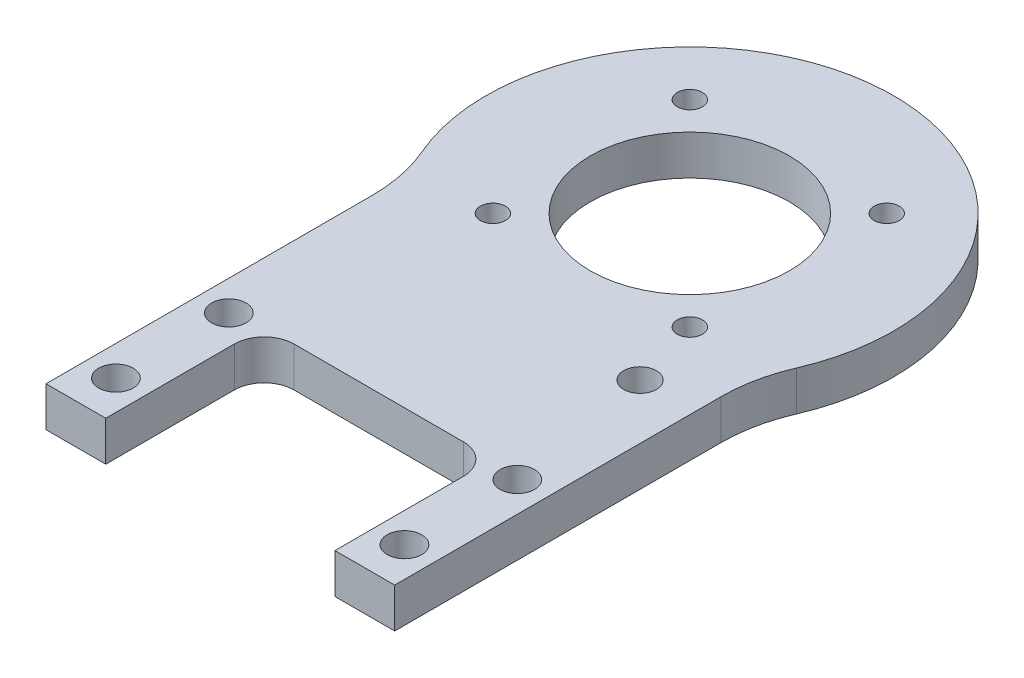
ISO-10303-21;
HEADER;
FILE_DESCRIPTION(('STEP AP214'),'2;1');
FILE_NAME('part.step','',(''),(''),'','','');
FILE_SCHEMA(('AUTOMOTIVE_DESIGN { 1 0 10303 214 1 1 1 1 }'));
ENDSEC;
DATA;
#1=APPLICATION_CONTEXT('core data for automotive mechanical design processes');
#2=APPLICATION_PROTOCOL_DEFINITION('international standard','automotive_design',2000,#1);
#3=PRODUCT_CONTEXT('',#1,'mechanical');
#4=PRODUCT('Part','Part','',(#3));
#5=PRODUCT_RELATED_PRODUCT_CATEGORY('part','',(#4));
#6=PRODUCT_DEFINITION_FORMATION('','',#4);
#7=PRODUCT_DEFINITION_CONTEXT('part definition',#1,'design');
#8=PRODUCT_DEFINITION('design','',#6,#7);
#9=PRODUCT_DEFINITION_SHAPE('','',#8);
#10=(LENGTH_UNIT() NAMED_UNIT(*) SI_UNIT(.MILLI.,.METRE.));
#11=(NAMED_UNIT(*) PLANE_ANGLE_UNIT() SI_UNIT($,.RADIAN.));
#12=(NAMED_UNIT(*) SI_UNIT($,.STERADIAN.) SOLID_ANGLE_UNIT());
#13=UNCERTAINTY_MEASURE_WITH_UNIT(LENGTH_MEASURE(1.E-05),#10,'distance_accuracy_value','');
#14=(GEOMETRIC_REPRESENTATION_CONTEXT(3) GLOBAL_UNCERTAINTY_ASSIGNED_CONTEXT((#13)) GLOBAL_UNIT_ASSIGNED_CONTEXT((#10,
#11,#12)) REPRESENTATION_CONTEXT('',''));
#15=CARTESIAN_POINT('',(0.,0.,0.));
#16=DIRECTION('',(0.,0.,1.));
#17=DIRECTION('',(1.,0.,0.));
#18=AXIS2_PLACEMENT_3D('',#15,#16,#17);
#19=CARTESIAN_POINT('',(0.,601.119027045273,-3.206573008689));
#20=DIRECTION('',(0.,-1.,0.));
#21=DIRECTION('',(0.,0.,-1.));
#22=AXIS2_PLACEMENT_3D('',#19,#20,#21);
#23=CYLINDRICAL_SURFACE('',#22,32.4999985);
#24=CARTESIAN_POINT('',(0.,594.769027045273,-3.20657300868901));
#25=DIRECTION('',(0.,1.,0.));
#26=DIRECTION('',(0.,0.,1.));
#27=AXIS2_PLACEMENT_3D('',#24,#25,#26);
#28=CIRCLE('',#27,32.4999985);
#29=CARTESIAN_POINT('',(-29.859023576828,594.769027045273,9.6265331444771));
#30=VERTEX_POINT('',#29);
#31=CARTESIAN_POINT('',(29.8590235768281,594.769027045273,9.62653314447709));
#32=VERTEX_POINT('',#31);
#33=EDGE_CURVE('E183',#30,#32,#28,.F.);
#34=ORIENTED_EDGE('',*,*,#33,.F.);
#35=DIRECTION('',(0.,-1.,0.));
#36=VECTOR('',#35,1.);
#37=CARTESIAN_POINT('',(-29.859023576828,601.119027045273,9.6265331444771));
#38=LINE('',#37,#36);
#39=CARTESIAN_POINT('',(-29.859023576828,601.119027045273,9.6265331444771));
#40=VERTEX_POINT('',#39);
#41=EDGE_CURVE('E11',#40,#30,#38,.T.);
#42=ORIENTED_EDGE('',*,*,#41,.F.);
#43=CARTESIAN_POINT('',(0.,601.119027045273,-3.206573008689));
#44=DIRECTION('',(0.,1.,0.));
#45=DIRECTION('',(0.,0.,1.));
#46=AXIS2_PLACEMENT_3D('',#43,#44,#45);
#47=CIRCLE('',#46,32.4999985);
#48=CARTESIAN_POINT('',(29.8590235768281,601.119027045273,9.62653314447709));
#49=VERTEX_POINT('',#48);
#50=EDGE_CURVE('E365',#40,#49,#47,.F.);
#51=ORIENTED_EDGE('',*,*,#50,.T.);
#52=DIRECTION('',(0.,-1.,0.));
#53=VECTOR('',#52,1.);
#54=CARTESIAN_POINT('',(29.8590235768281,601.119027045273,9.62653314447709));
#55=LINE('',#54,#53);
#56=EDGE_CURVE('E52',#49,#32,#55,.T.);
#57=ORIENTED_EDGE('',*,*,#56,.T.);
#58=EDGE_LOOP('',(#34,#42,#51,#57));
#59=FACE_BOUND('',#58,.T.);
#60=ADVANCED_FACE('F35',(#59),#23,.T.);
#61=CARTESIAN_POINT('',(-53.1950000031479,601.119027045273,19.6560996470854));
#62=DIRECTION('',(0.,-1.,0.));
#63=DIRECTION('',(0.,0.,-1.));
#64=AXIS2_PLACEMENT_3D('',#61,#62,#63);
#65=CYLINDRICAL_SURFACE('',#64,25.4);
#66=CARTESIAN_POINT('',(-53.1950000031479,594.769027045273,19.6560996470854));
#67=DIRECTION('',(0.,1.,0.));
#68=DIRECTION('',(0.,0.,1.));
#69=AXIS2_PLACEMENT_3D('',#66,#67,#68);
#70=CIRCLE('',#69,25.4);
#71=CARTESIAN_POINT('',(-27.7950000031479,594.769027045273,19.6560996470854));
#72=VERTEX_POINT('',#71);
#73=EDGE_CURVE('E180',#30,#72,#70,.F.);
#74=ORIENTED_EDGE('',*,*,#73,.T.);
#75=DIRECTION('',(0.,-1.,0.));
#76=VECTOR('',#75,1.);
#77=CARTESIAN_POINT('',(-27.7950000031479,601.119027045273,19.6560996470854));
#78=LINE('',#77,#76);
#79=CARTESIAN_POINT('',(-27.7950000031479,601.119027045273,19.6560996470854));
#80=VERTEX_POINT('',#79);
#81=EDGE_CURVE('E44',#80,#72,#78,.T.);
#82=ORIENTED_EDGE('',*,*,#81,.F.);
#83=CARTESIAN_POINT('',(-53.1950000031479,601.119027045273,19.6560996470854));
#84=DIRECTION('',(0.,1.,0.));
#85=DIRECTION('',(0.,0.,1.));
#86=AXIS2_PLACEMENT_3D('',#83,#84,#85);
#87=CIRCLE('',#86,25.4);
#88=EDGE_CURVE('E363',#40,#80,#87,.F.);
#89=ORIENTED_EDGE('',*,*,#88,.F.);
#90=ORIENTED_EDGE('',*,*,#41,.T.);
#91=EDGE_LOOP('',(#74,#82,#89,#90));
#92=FACE_BOUND('',#91,.T.);
#93=ADVANCED_FACE('F181',(#92),#65,.F.);
#94=CARTESIAN_POINT('',(-27.7950000031479,601.119027045273,0.));
#95=DIRECTION('',(-1.,0.,0.));
#96=DIRECTION('',(0.,-1.,0.));
#97=AXIS2_PLACEMENT_3D('',#94,#95,#96);
#98=PLANE('',#97);
#99=DIRECTION('',(0.,0.,-1.));
#100=VECTOR('',#99,1.);
#101=CARTESIAN_POINT('',(-27.7950000031479,594.769027045273,0.));
#102=LINE('',#101,#100);
#103=CARTESIAN_POINT('',(-27.7950000031479,594.769027045273,71.6409269913124));
#104=VERTEX_POINT('',#103);
#105=EDGE_CURVE('E174',#104,#72,#102,.T.);
#106=ORIENTED_EDGE('',*,*,#105,.F.);
#107=DIRECTION('',(0.,-1.,0.));
#108=VECTOR('',#107,1.);
#109=CARTESIAN_POINT('',(-27.7950000031479,601.119027045273,71.6409269913124));
#110=LINE('',#109,#108);
#111=CARTESIAN_POINT('',(-27.7950000031479,601.119027045273,71.6409269913124));
#112=VERTEX_POINT('',#111);
#113=EDGE_CURVE('E166',#112,#104,#110,.T.);
#114=ORIENTED_EDGE('',*,*,#113,.F.);
#115=DIRECTION('',(0.,0.,-1.));
#116=VECTOR('',#115,1.);
#117=CARTESIAN_POINT('',(-27.7950000031479,601.119027045273,0.));
#118=LINE('',#117,#116);
#119=EDGE_CURVE('E177',#112,#80,#118,.T.);
#120=ORIENTED_EDGE('',*,*,#119,.T.);
#121=ORIENTED_EDGE('',*,*,#81,.T.);
#122=EDGE_LOOP('',(#106,#114,#120,#121));
#123=FACE_BOUND('',#122,.T.);
#124=ADVANCED_FACE('F172',(#123),#98,.T.);
#125=CARTESIAN_POINT('',(0.,601.119027045273,71.6409269913124));
#126=DIRECTION('',(0.,0.,1.));
#127=DIRECTION('',(0.,-1.,0.));
#128=AXIS2_PLACEMENT_3D('',#125,#126,#127);
#129=PLANE('',#128);
#130=DIRECTION('',(-1.,0.,0.));
#131=VECTOR('',#130,1.);
#132=CARTESIAN_POINT('',(0.,594.769027045273,71.6409269913124));
#133=LINE('',#132,#131);
#134=CARTESIAN_POINT('',(-18.2700000031479,594.769027045273,71.6409269913124));
#135=VERTEX_POINT('',#134);
#136=EDGE_CURVE('E189',#135,#104,#133,.T.);
#137=ORIENTED_EDGE('',*,*,#136,.F.);
#138=DIRECTION('',(0.,-1.,0.));
#139=VECTOR('',#138,1.);
#140=CARTESIAN_POINT('',(-18.2700000031479,601.119027045273,71.6409269913124));
#141=LINE('',#140,#139);
#142=CARTESIAN_POINT('',(-18.2700000031479,601.119027045273,71.6409269913124));
#143=VERTEX_POINT('',#142);
#144=EDGE_CURVE('E164',#143,#135,#141,.T.);
#145=ORIENTED_EDGE('',*,*,#144,.F.);
#146=DIRECTION('',(-1.,0.,0.));
#147=VECTOR('',#146,1.);
#148=CARTESIAN_POINT('',(0.,601.119027045273,71.6409269913124));
#149=LINE('',#148,#147);
#150=EDGE_CURVE('E359',#143,#112,#149,.T.);
#151=ORIENTED_EDGE('',*,*,#150,.T.);
#152=ORIENTED_EDGE('',*,*,#113,.T.);
#153=EDGE_LOOP('',(#137,#145,#151,#152));
#154=FACE_BOUND('',#153,.T.);
#155=ADVANCED_FACE('F399',(#154),#129,.T.);
#156=CARTESIAN_POINT('',(-18.2700000031479,601.119027045273,0.));
#157=DIRECTION('',(1.,0.,0.));
#158=DIRECTION('',(0.,0.,-1.));
#159=AXIS2_PLACEMENT_3D('',#156,#157,#158);
#160=PLANE('',#159);
#161=DIRECTION('',(0.,0.,1.));
#162=VECTOR('',#161,1.);
#163=CARTESIAN_POINT('',(-18.2700000031479,594.769027045273,0.));
#164=LINE('',#163,#162);
#165=CARTESIAN_POINT('',(-18.2700000031479,594.769027045273,51.1484269916459));
#166=VERTEX_POINT('',#165);
#167=EDGE_CURVE('E191',#166,#135,#164,.T.);
#168=ORIENTED_EDGE('',*,*,#167,.F.);
#169=DIRECTION('',(0.,-1.,0.));
#170=VECTOR('',#169,1.);
#171=CARTESIAN_POINT('',(-18.2700000031479,601.119027045273,51.1484269916459));
#172=LINE('',#171,#170);
#173=CARTESIAN_POINT('',(-18.2700000031479,601.119027045273,51.1484269916459));
#174=VERTEX_POINT('',#173);
#175=EDGE_CURVE('E162',#174,#166,#172,.T.);
#176=ORIENTED_EDGE('',*,*,#175,.F.);
#177=DIRECTION('',(0.,0.,1.));
#178=VECTOR('',#177,1.);
#179=CARTESIAN_POINT('',(-18.2700000031479,601.119027045273,0.));
#180=LINE('',#179,#178);
#181=EDGE_CURVE('E356',#174,#143,#180,.T.);
#182=ORIENTED_EDGE('',*,*,#181,.T.);
#183=ORIENTED_EDGE('',*,*,#144,.T.);
#184=EDGE_LOOP('',(#168,#176,#182,#183));
#185=FACE_BOUND('',#184,.T.);
#186=ADVANCED_FACE('F402',(#185),#160,.T.);
#187=CARTESIAN_POINT('',(-13.5075000031479,601.119027045273,51.1484269916459));
#188=DIRECTION('',(0.,-1.,0.));
#189=DIRECTION('',(0.,0.,-1.));
#190=AXIS2_PLACEMENT_3D('',#187,#188,#189);
#191=CYLINDRICAL_SURFACE('',#190,4.76250000000001);
#192=CARTESIAN_POINT('',(-13.5075000031479,594.769027045273,51.1484269916459));
#193=DIRECTION('',(0.,1.,0.));
#194=DIRECTION('',(0.,0.,1.));
#195=AXIS2_PLACEMENT_3D('',#192,#193,#194);
#196=CIRCLE('',#195,4.76250000000001);
#197=CARTESIAN_POINT('',(-13.5075000032041,594.769027045273,46.3859269916459));
#198=VERTEX_POINT('',#197);
#199=EDGE_CURVE('E196',#166,#198,#196,.F.);
#200=ORIENTED_EDGE('',*,*,#199,.T.);
#201=DIRECTION('',(0.,-1.,0.));
#202=VECTOR('',#201,1.);
#203=CARTESIAN_POINT('',(-13.5075000032041,601.119027045273,46.3859269916459));
#204=LINE('',#203,#202);
#205=CARTESIAN_POINT('',(-13.5075000032041,601.119027045273,46.3859269916459));
#206=VERTEX_POINT('',#205);
#207=EDGE_CURVE('E160',#206,#198,#204,.T.);
#208=ORIENTED_EDGE('',*,*,#207,.F.);
#209=CARTESIAN_POINT('',(-13.5075000031479,601.119027045273,51.1484269916459));
#210=DIRECTION('',(0.,1.,0.));
#211=DIRECTION('',(0.,0.,1.));
#212=AXIS2_PLACEMENT_3D('',#209,#210,#211);
#213=CIRCLE('',#212,4.76250000000001);
#214=EDGE_CURVE('E354',#174,#206,#213,.F.);
#215=ORIENTED_EDGE('',*,*,#214,.F.);
#216=ORIENTED_EDGE('',*,*,#175,.T.);
#217=EDGE_LOOP('',(#200,#208,#215,#216));
#218=FACE_BOUND('',#217,.T.);
#219=ADVANCED_FACE('F407',(#218),#191,.F.);
#220=CARTESIAN_POINT('',(5.47609017684926E-10,601.119027045273,46.3859269914864));
#221=DIRECTION('',(1.1805494782E-11,0.,1.));
#222=DIRECTION('',(1.,0.,-1.1805494782E-11));
#223=AXIS2_PLACEMENT_3D('',#220,#221,#222);
#224=PLANE('',#223);
#225=DIRECTION('',(-1.,0.,1.1805494782E-11));
#226=VECTOR('',#225,1.);
#227=CARTESIAN_POINT('',(5.47608819056227E-10,594.769027045273,46.3859269914864));
#228=LINE('',#227,#226);
#229=CARTESIAN_POINT('',(13.5075000032042,594.769027045273,46.3859269916459));
#230=VERTEX_POINT('',#229);
#231=EDGE_CURVE('E199',#230,#198,#228,.T.);
#232=ORIENTED_EDGE('',*,*,#231,.F.);
#233=DIRECTION('',(0.,-1.,0.));
#234=VECTOR('',#233,1.);
#235=CARTESIAN_POINT('',(13.5075000032042,601.119027045273,46.3859269916459));
#236=LINE('',#235,#234);
#237=CARTESIAN_POINT('',(13.5075000032042,601.119027045273,46.3859269916459));
#238=VERTEX_POINT('',#237);
#239=EDGE_CURVE('E158',#238,#230,#236,.T.);
#240=ORIENTED_EDGE('',*,*,#239,.F.);
#241=DIRECTION('',(-1.,0.,1.1805494782E-11));
#242=VECTOR('',#241,1.);
#243=CARTESIAN_POINT('',(5.47609017684926E-10,601.119027045273,46.3859269914864));
#244=LINE('',#243,#242);
#245=EDGE_CURVE('E351',#238,#206,#244,.T.);
#246=ORIENTED_EDGE('',*,*,#245,.T.);
#247=ORIENTED_EDGE('',*,*,#207,.T.);
#248=EDGE_LOOP('',(#232,#240,#246,#247));
#249=FACE_BOUND('',#248,.T.);
#250=ADVANCED_FACE('F411',(#249),#224,.T.);
#251=CARTESIAN_POINT('',(13.5075000031479,601.119027045273,51.1484269916459));
#252=DIRECTION('',(0.,-1.,0.));
#253=DIRECTION('',(0.,0.,-1.));
#254=AXIS2_PLACEMENT_3D('',#251,#252,#253);
#255=CYLINDRICAL_SURFACE('',#254,4.76250000000001);
#256=CARTESIAN_POINT('',(13.5075000031479,594.769027045273,51.1484269916459));
#257=DIRECTION('',(0.,1.,0.));
#258=DIRECTION('',(0.,0.,1.));
#259=AXIS2_PLACEMENT_3D('',#256,#257,#258);
#260=CIRCLE('',#259,4.76250000000001);
#261=CARTESIAN_POINT('',(18.2700000031479,594.769027045273,51.1484269916459));
#262=VERTEX_POINT('',#261);
#263=EDGE_CURVE('E202',#262,#230,#260,.T.);
#264=ORIENTED_EDGE('',*,*,#263,.F.);
#265=DIRECTION('',(0.,-1.,0.));
#266=VECTOR('',#265,1.);
#267=CARTESIAN_POINT('',(18.2700000031479,601.119027045273,51.1484269916459));
#268=LINE('',#267,#266);
#269=CARTESIAN_POINT('',(18.2700000031479,601.119027045273,51.1484269916459));
#270=VERTEX_POINT('',#269);
#271=EDGE_CURVE('E152',#270,#262,#268,.T.);
#272=ORIENTED_EDGE('',*,*,#271,.F.);
#273=CARTESIAN_POINT('',(13.5075000031479,601.119027045273,51.1484269916459));
#274=DIRECTION('',(0.,1.,0.));
#275=DIRECTION('',(0.,0.,1.));
#276=AXIS2_PLACEMENT_3D('',#273,#274,#275);
#277=CIRCLE('',#276,4.76250000000001);
#278=EDGE_CURVE('E348',#270,#238,#277,.T.);
#279=ORIENTED_EDGE('',*,*,#278,.T.);
#280=ORIENTED_EDGE('',*,*,#239,.T.);
#281=EDGE_LOOP('',(#264,#272,#279,#280));
#282=FACE_BOUND('',#281,.T.);
#283=ADVANCED_FACE('F414',(#282),#255,.F.);
#284=CARTESIAN_POINT('',(18.270000003148,601.119027045273,0.));
#285=DIRECTION('',(1.,0.,0.));
#286=DIRECTION('',(0.,0.,-1.));
#287=AXIS2_PLACEMENT_3D('',#284,#285,#286);
#288=PLANE('',#287);
#289=DIRECTION('',(0.,0.,1.));
#290=VECTOR('',#289,1.);
#291=CARTESIAN_POINT('',(18.270000003148,594.769027045273,0.));
#292=LINE('',#291,#290);
#293=CARTESIAN_POINT('',(18.2700000031479,594.769027045273,71.6409269913124));
#294=VERTEX_POINT('',#293);
#295=EDGE_CURVE('E205',#262,#294,#292,.T.);
#296=ORIENTED_EDGE('',*,*,#295,.T.);
#297=DIRECTION('',(0.,-1.,0.));
#298=VECTOR('',#297,1.);
#299=CARTESIAN_POINT('',(18.2700000031479,601.119027045273,71.6409269913124));
#300=LINE('',#299,#298);
#301=CARTESIAN_POINT('',(18.2700000031479,601.119027045273,71.6409269913124));
#302=VERTEX_POINT('',#301);
#303=EDGE_CURVE('E150',#302,#294,#300,.T.);
#304=ORIENTED_EDGE('',*,*,#303,.F.);
#305=DIRECTION('',(0.,0.,1.));
#306=VECTOR('',#305,1.);
#307=CARTESIAN_POINT('',(18.270000003148,601.119027045273,0.));
#308=LINE('',#307,#306);
#309=EDGE_CURVE('E143',#270,#302,#308,.T.);
#310=ORIENTED_EDGE('',*,*,#309,.F.);
#311=ORIENTED_EDGE('',*,*,#271,.T.);
#312=EDGE_LOOP('',(#296,#304,#310,#311));
#313=FACE_BOUND('',#312,.T.);
#314=ADVANCED_FACE('F417',(#313),#288,.F.);
#315=CARTESIAN_POINT('',(0.,601.119027045273,71.6409269913124));
#316=DIRECTION('',(0.,0.,-1.));
#317=DIRECTION('',(0.,1.,0.));
#318=AXIS2_PLACEMENT_3D('',#315,#316,#317);
#319=PLANE('',#318);
#320=DIRECTION('',(1.,0.,0.));
#321=VECTOR('',#320,1.);
#322=CARTESIAN_POINT('',(0.,594.769027045273,71.6409269913124));
#323=LINE('',#322,#321);
#324=CARTESIAN_POINT('',(27.7950000031479,594.769027045273,71.6409269913124));
#325=VERTEX_POINT('',#324);
#326=EDGE_CURVE('E149',#294,#325,#323,.T.);
#327=ORIENTED_EDGE('',*,*,#326,.T.);
#328=DIRECTION('',(0.,-1.,0.));
#329=VECTOR('',#328,1.);
#330=CARTESIAN_POINT('',(27.7950000031479,601.119027045273,71.6409269913124));
#331=LINE('',#330,#329);
#332=CARTESIAN_POINT('',(27.7950000031479,601.119027045273,71.6409269913124));
#333=VERTEX_POINT('',#332);
#334=EDGE_CURVE('E130',#333,#325,#331,.T.);
#335=ORIENTED_EDGE('',*,*,#334,.F.);
#336=DIRECTION('',(1.,0.,0.));
#337=VECTOR('',#336,1.);
#338=CARTESIAN_POINT('',(0.,601.119027045273,71.6409269913124));
#339=LINE('',#338,#337);
#340=EDGE_CURVE('E135',#302,#333,#339,.T.);
#341=ORIENTED_EDGE('',*,*,#340,.F.);
#342=ORIENTED_EDGE('',*,*,#303,.T.);
#343=EDGE_LOOP('',(#327,#335,#341,#342));
#344=FACE_BOUND('',#343,.T.);
#345=ADVANCED_FACE('F148',(#344),#319,.F.);
#346=CARTESIAN_POINT('',(27.7950000031479,601.119027045273,0.));
#347=DIRECTION('',(-1.,0.,0.));
#348=DIRECTION('',(0.,-1.,0.));
#349=AXIS2_PLACEMENT_3D('',#346,#347,#348);
#350=PLANE('',#349);
#351=DIRECTION('',(0.,0.,-1.));
#352=VECTOR('',#351,1.);
#353=CARTESIAN_POINT('',(27.7950000031479,594.769027045273,0.));
#354=LINE('',#353,#352);
#355=CARTESIAN_POINT('',(27.7950000031479,594.769027045273,19.6560996470854));
#356=VERTEX_POINT('',#355);
#357=EDGE_CURVE('E209',#325,#356,#354,.T.);
#358=ORIENTED_EDGE('',*,*,#357,.T.);
#359=DIRECTION('',(0.,-1.,0.));
#360=VECTOR('',#359,1.);
#361=CARTESIAN_POINT('',(27.7950000031479,601.119027045273,19.6560996470854));
#362=LINE('',#361,#360);
#363=CARTESIAN_POINT('',(27.7950000031479,601.119027045273,19.6560996470854));
#364=VERTEX_POINT('',#363);
#365=EDGE_CURVE('E90',#364,#356,#362,.T.);
#366=ORIENTED_EDGE('',*,*,#365,.F.);
#367=DIRECTION('',(0.,0.,-1.));
#368=VECTOR('',#367,1.);
#369=CARTESIAN_POINT('',(27.7950000031479,601.119027045273,0.));
#370=LINE('',#369,#368);
#371=EDGE_CURVE('E126',#333,#364,#370,.T.);
#372=ORIENTED_EDGE('',*,*,#371,.F.);
#373=ORIENTED_EDGE('',*,*,#334,.T.);
#374=EDGE_LOOP('',(#358,#366,#372,#373));
#375=FACE_BOUND('',#374,.T.);
#376=ADVANCED_FACE('F128',(#375),#350,.F.);
#377=CARTESIAN_POINT('',(-23.,601.119027045273,47.2909269913124));
#378=DIRECTION('',(0.,-1.,0.));
#379=DIRECTION('',(0.,0.,-1.));
#380=AXIS2_PLACEMENT_3D('',#377,#378,#379);
#381=CYLINDRICAL_SURFACE('',#380,2.75000000007406);
#382=CARTESIAN_POINT('',(-23.,601.119027045273,47.2909269913124));
#383=DIRECTION('',(0.,1.,0.));
#384=DIRECTION('',(0.,0.,1.));
#385=AXIS2_PLACEMENT_3D('',#382,#383,#384);
#386=CIRCLE('',#385,2.75000000007406);
#387=CARTESIAN_POINT('',(-23.,601.119027045273,50.0409269913865));
#388=VERTEX_POINT('',#387);
#389=EDGE_CURVE('E228',#388,#388,#386,.T.);
#390=ORIENTED_EDGE('',*,*,#389,.T.);
#391=EDGE_LOOP('',(#390));
#392=FACE_BOUND('',#391,.T.);
#393=CARTESIAN_POINT('',(-23.,594.769027045273,47.2909269913124));
#394=DIRECTION('',(0.,1.,0.));
#395=DIRECTION('',(0.,0.,1.));
#396=AXIS2_PLACEMENT_3D('',#393,#394,#395);
#397=CIRCLE('',#396,2.75000000007406);
#398=CARTESIAN_POINT('',(-23.,594.769027045273,50.0409269913865));
#399=VERTEX_POINT('',#398);
#400=EDGE_CURVE('E220',#399,#399,#397,.T.);
#401=ORIENTED_EDGE('',*,*,#400,.F.);
#402=EDGE_LOOP('',(#401));
#403=FACE_BOUND('',#402,.T.);
#404=ADVANCED_FACE('F322',(#392,#403),#381,.F.);
#405=CARTESIAN_POINT('',(-23.,601.119027045273,65.2909269913124));
#406=DIRECTION('',(0.,-1.,0.));
#407=DIRECTION('',(0.,0.,-1.));
#408=AXIS2_PLACEMENT_3D('',#405,#406,#407);
#409=CYLINDRICAL_SURFACE('',#408,2.75000000007406);
#410=CARTESIAN_POINT('',(-23.,601.119027045273,65.2909269913124));
#411=DIRECTION('',(0.,1.,0.));
#412=DIRECTION('',(0.,0.,1.));
#413=AXIS2_PLACEMENT_3D('',#410,#411,#412);
#414=CIRCLE('',#413,2.75000000007406);
#415=CARTESIAN_POINT('',(-23.,601.119027045273,68.0409269913865));
#416=VERTEX_POINT('',#415);
#417=EDGE_CURVE('E233',#416,#416,#414,.T.);
#418=ORIENTED_EDGE('',*,*,#417,.T.);
#419=EDGE_LOOP('',(#418));
#420=FACE_BOUND('',#419,.T.);
#421=CARTESIAN_POINT('',(-23.,594.769027045273,65.2909269913124));
#422=DIRECTION('',(0.,1.,0.));
#423=DIRECTION('',(0.,0.,1.));
#424=AXIS2_PLACEMENT_3D('',#421,#422,#423);
#425=CIRCLE('',#424,2.75000000007406);
#426=CARTESIAN_POINT('',(-23.,594.769027045273,68.0409269913865));
#427=VERTEX_POINT('',#426);
#428=EDGE_CURVE('E217',#427,#427,#425,.T.);
#429=ORIENTED_EDGE('',*,*,#428,.F.);
#430=EDGE_LOOP('',(#429));
#431=FACE_BOUND('',#430,.T.);
#432=ADVANCED_FACE('F264',(#420,#431),#409,.F.);
#433=CARTESIAN_POINT('',(23.,601.119027045273,47.2909269913124));
#434=DIRECTION('',(0.,-1.,0.));
#435=DIRECTION('',(0.,0.,-1.));
#436=AXIS2_PLACEMENT_3D('',#433,#434,#435);
#437=CYLINDRICAL_SURFACE('',#436,2.75000000007407);
#438=CARTESIAN_POINT('',(23.,601.119027045273,47.2909269913124));
#439=DIRECTION('',(0.,1.,0.));
#440=DIRECTION('',(0.,0.,1.));
#441=AXIS2_PLACEMENT_3D('',#438,#439,#440);
#442=CIRCLE('',#441,2.75000000007407);
#443=CARTESIAN_POINT('',(23.,601.119027045273,50.0409269913865));
#444=VERTEX_POINT('',#443);
#445=EDGE_CURVE('E342',#444,#444,#442,.T.);
#446=ORIENTED_EDGE('',*,*,#445,.T.);
#447=EDGE_LOOP('',(#446));
#448=FACE_BOUND('',#447,.T.);
#449=CARTESIAN_POINT('',(23.,594.769027045273,47.2909269913124));
#450=DIRECTION('',(0.,1.,0.));
#451=DIRECTION('',(0.,0.,1.));
#452=AXIS2_PLACEMENT_3D('',#449,#450,#451);
#453=CIRCLE('',#452,2.75000000007407);
#454=CARTESIAN_POINT('',(23.,594.769027045273,50.0409269913865));
#455=VERTEX_POINT('',#454);
#456=EDGE_CURVE('E214',#455,#455,#453,.T.);
#457=ORIENTED_EDGE('',*,*,#456,.F.);
#458=EDGE_LOOP('',(#457));
#459=FACE_BOUND('',#458,.T.);
#460=ADVANCED_FACE('F255',(#448,#459),#437,.F.);
#461=CARTESIAN_POINT('',(53.195000003148,601.119027045273,19.6560996470854));
#462=DIRECTION('',(0.,-1.,0.));
#463=DIRECTION('',(0.,0.,-1.));
#464=AXIS2_PLACEMENT_3D('',#461,#462,#463);
#465=CYLINDRICAL_SURFACE('',#464,25.4);
#466=CARTESIAN_POINT('',(53.195000003148,594.769027045273,19.6560996470854));
#467=DIRECTION('',(0.,1.,0.));
#468=DIRECTION('',(0.,0.,1.));
#469=AXIS2_PLACEMENT_3D('',#466,#467,#468);
#470=CIRCLE('',#469,25.4);
#471=EDGE_CURVE('E211',#32,#356,#470,.T.);
#472=ORIENTED_EDGE('',*,*,#471,.F.);
#473=ORIENTED_EDGE('',*,*,#56,.F.);
#474=CARTESIAN_POINT('',(53.195000003148,601.119027045273,19.6560996470854));
#475=DIRECTION('',(0.,1.,0.));
#476=DIRECTION('',(0.,0.,1.));
#477=AXIS2_PLACEMENT_3D('',#474,#475,#476);
#478=CIRCLE('',#477,25.4);
#479=EDGE_CURVE('E134',#49,#364,#478,.T.);
#480=ORIENTED_EDGE('',*,*,#479,.T.);
#481=ORIENTED_EDGE('',*,*,#365,.T.);
#482=EDGE_LOOP('',(#472,#473,#480,#481));
#483=FACE_BOUND('',#482,.T.);
#484=ADVANCED_FACE('F252',(#483),#465,.F.);
#485=CARTESIAN_POINT('',(15.6977705423415,601.119027045273,12.4911975336523));
#486=DIRECTION('',(0.,-1.,0.));
#487=DIRECTION('',(0.,0.,-1.));
#488=AXIS2_PLACEMENT_3D('',#485,#486,#487);
#489=CYLINDRICAL_SURFACE('',#488,1.99999600007368);
#490=CARTESIAN_POINT('',(15.6977705423415,601.119027045273,12.4911975336523));
#491=DIRECTION('',(0.,1.,0.));
#492=DIRECTION('',(0.,0.,1.));
#493=AXIS2_PLACEMENT_3D('',#490,#491,#492);
#494=CIRCLE('',#493,1.99999600007368);
#495=CARTESIAN_POINT('',(15.6977705423415,601.119027045273,14.4911935337259));
#496=VERTEX_POINT('',#495);
#497=EDGE_CURVE('E367',#496,#496,#494,.T.);
#498=ORIENTED_EDGE('',*,*,#497,.T.);
#499=EDGE_LOOP('',(#498));
#500=FACE_BOUND('',#499,.T.);
#501=CARTESIAN_POINT('',(15.6977705423415,594.769027045273,12.4911975336523));
#502=DIRECTION('',(0.,1.,0.));
#503=DIRECTION('',(0.,0.,1.));
#504=AXIS2_PLACEMENT_3D('',#501,#502,#503);
#505=CIRCLE('',#504,1.99999600007368);
#506=CARTESIAN_POINT('',(15.6977705423415,594.769027045273,14.4911935337259));
#507=VERTEX_POINT('',#506);
#508=EDGE_CURVE('E250',#507,#507,#505,.T.);
#509=ORIENTED_EDGE('',*,*,#508,.F.);
#510=EDGE_LOOP('',(#509));
#511=FACE_BOUND('',#510,.T.);
#512=ADVANCED_FACE('F254',(#500,#511),#489,.F.);
#513=CARTESIAN_POINT('',(15.6977705423413,601.119027045273,-18.9043435510304));
#514=DIRECTION('',(0.,-1.,0.));
#515=DIRECTION('',(0.,0.,-1.));
#516=AXIS2_PLACEMENT_3D('',#513,#514,#515);
#517=CYLINDRICAL_SURFACE('',#516,1.99999600007369);
#518=CARTESIAN_POINT('',(15.6977705423413,601.119027045273,-18.9043435510304));
#519=DIRECTION('',(0.,1.,0.));
#520=DIRECTION('',(0.,0.,1.));
#521=AXIS2_PLACEMENT_3D('',#518,#519,#520);
#522=CIRCLE('',#521,1.99999600007369);
#523=CARTESIAN_POINT('',(15.6977705423413,601.119027045273,-16.9043475509568));
#524=VERTEX_POINT('',#523);
#525=EDGE_CURVE('E370',#524,#524,#522,.T.);
#526=ORIENTED_EDGE('',*,*,#525,.T.);
#527=EDGE_LOOP('',(#526));
#528=FACE_BOUND('',#527,.T.);
#529=CARTESIAN_POINT('',(15.6977705423413,594.769027045273,-18.9043435510304));
#530=DIRECTION('',(0.,1.,0.));
#531=DIRECTION('',(0.,0.,1.));
#532=AXIS2_PLACEMENT_3D('',#529,#530,#531);
#533=CIRCLE('',#532,1.99999600007369);
#534=CARTESIAN_POINT('',(15.6977705423413,594.769027045273,-16.9043475509568));
#535=VERTEX_POINT('',#534);
#536=EDGE_CURVE('E247',#535,#535,#533,.T.);
#537=ORIENTED_EDGE('',*,*,#536,.F.);
#538=EDGE_LOOP('',(#537));
#539=FACE_BOUND('',#538,.T.);
#540=ADVANCED_FACE('F261',(#528,#539),#517,.F.);
#541=CARTESIAN_POINT('',(-15.6977705423414,601.119027045273,-18.9043435510303));
#542=DIRECTION('',(0.,-1.,0.));
#543=DIRECTION('',(0.,0.,-1.));
#544=AXIS2_PLACEMENT_3D('',#541,#542,#543);
#545=CYLINDRICAL_SURFACE('',#544,1.99999600007368);
#546=CARTESIAN_POINT('',(-15.6977705423414,601.119027045273,-18.9043435510303));
#547=DIRECTION('',(0.,1.,0.));
#548=DIRECTION('',(0.,0.,1.));
#549=AXIS2_PLACEMENT_3D('',#546,#547,#548);
#550=CIRCLE('',#549,1.99999600007368);
#551=CARTESIAN_POINT('',(-15.6977705423414,601.119027045273,-16.9043475509566));
#552=VERTEX_POINT('',#551);
#553=EDGE_CURVE('E373',#552,#552,#550,.T.);
#554=ORIENTED_EDGE('',*,*,#553,.T.);
#555=EDGE_LOOP('',(#554));
#556=FACE_BOUND('',#555,.T.);
#557=CARTESIAN_POINT('',(-15.6977705423414,594.769027045273,-18.9043435510303));
#558=DIRECTION('',(0.,1.,0.));
#559=DIRECTION('',(0.,0.,1.));
#560=AXIS2_PLACEMENT_3D('',#557,#558,#559);
#561=CIRCLE('',#560,1.99999600007368);
#562=CARTESIAN_POINT('',(-15.6977705423414,594.769027045273,-16.9043475509566));
#563=VERTEX_POINT('',#562);
#564=EDGE_CURVE('E244',#563,#563,#561,.T.);
#565=ORIENTED_EDGE('',*,*,#564,.F.);
#566=EDGE_LOOP('',(#565));
#567=FACE_BOUND('',#566,.T.);
#568=ADVANCED_FACE('F278',(#556,#567),#545,.F.);
#569=CARTESIAN_POINT('',(-15.6977705423413,601.119027045273,12.4911975336524));
#570=DIRECTION('',(0.,-1.,0.));
#571=DIRECTION('',(0.,0.,-1.));
#572=AXIS2_PLACEMENT_3D('',#569,#570,#571);
#573=CYLINDRICAL_SURFACE('',#572,1.99999600007369);
#574=CARTESIAN_POINT('',(-15.6977705423413,601.119027045273,12.4911975336524));
#575=DIRECTION('',(0.,1.,0.));
#576=DIRECTION('',(0.,0.,1.));
#577=AXIS2_PLACEMENT_3D('',#574,#575,#576);
#578=CIRCLE('',#577,1.99999600007369);
#579=CARTESIAN_POINT('',(-15.6977705423413,601.119027045273,14.4911935337261));
#580=VERTEX_POINT('',#579);
#581=EDGE_CURVE('E293',#580,#580,#578,.T.);
#582=ORIENTED_EDGE('',*,*,#581,.T.);
#583=EDGE_LOOP('',(#582));
#584=FACE_BOUND('',#583,.T.);
#585=CARTESIAN_POINT('',(-15.6977705423413,594.769027045273,12.4911975336524));
#586=DIRECTION('',(0.,1.,0.));
#587=DIRECTION('',(0.,0.,1.));
#588=AXIS2_PLACEMENT_3D('',#585,#586,#587);
#589=CIRCLE('',#588,1.99999600007369);
#590=CARTESIAN_POINT('',(-15.6977705423413,594.769027045273,14.4911935337261));
#591=VERTEX_POINT('',#590);
#592=EDGE_CURVE('E240',#591,#591,#589,.T.);
#593=ORIENTED_EDGE('',*,*,#592,.F.);
#594=EDGE_LOOP('',(#593));
#595=FACE_BOUND('',#594,.T.);
#596=ADVANCED_FACE('F281',(#584,#595),#573,.F.);
#597=CARTESIAN_POINT('',(0.,601.119027045273,-3.206573008689));
#598=DIRECTION('',(0.,-1.,0.));
#599=DIRECTION('',(0.,0.,-1.));
#600=AXIS2_PLACEMENT_3D('',#597,#598,#599);
#601=CYLINDRICAL_SURFACE('',#600,15.8750000000737);
#602=CARTESIAN_POINT('',(0.,601.119027045273,-3.206573008689));
#603=DIRECTION('',(0.,1.,0.));
#604=DIRECTION('',(0.,0.,1.));
#605=AXIS2_PLACEMENT_3D('',#602,#603,#604);
#606=CIRCLE('',#605,15.8750000000737);
#607=CARTESIAN_POINT('',(0.,601.119027045273,12.6684269913847));
#608=VERTEX_POINT('',#607);
#609=EDGE_CURVE('E225',#608,#608,#606,.T.);
#610=ORIENTED_EDGE('',*,*,#609,.T.);
#611=EDGE_LOOP('',(#610));
#612=FACE_BOUND('',#611,.T.);
#613=CARTESIAN_POINT('',(0.,594.769027045273,-3.20657300868901));
#614=DIRECTION('',(0.,1.,0.));
#615=DIRECTION('',(0.,0.,1.));
#616=AXIS2_PLACEMENT_3D('',#613,#614,#615);
#617=CIRCLE('',#616,15.8750000000737);
#618=CARTESIAN_POINT('',(0.,594.769027045273,12.6684269913847));
#619=VERTEX_POINT('',#618);
#620=EDGE_CURVE('E237',#619,#619,#617,.T.);
#621=ORIENTED_EDGE('',*,*,#620,.F.);
#622=EDGE_LOOP('',(#621));
#623=FACE_BOUND('',#622,.T.);
#624=ADVANCED_FACE('F37',(#612,#623),#601,.F.);
#625=CARTESIAN_POINT('',(23.,601.119027045273,65.2909269913124));
#626=DIRECTION('',(0.,-1.,0.));
#627=DIRECTION('',(0.,0.,-1.));
#628=AXIS2_PLACEMENT_3D('',#625,#626,#627);
#629=CYLINDRICAL_SURFACE('',#628,2.75000000007407);
#630=CARTESIAN_POINT('',(23.,601.119027045273,65.2909269913124));
#631=DIRECTION('',(0.,1.,0.));
#632=DIRECTION('',(0.,0.,1.));
#633=AXIS2_PLACEMENT_3D('',#630,#631,#632);
#634=CIRCLE('',#633,2.75000000007407);
#635=CARTESIAN_POINT('',(23.,601.119027045273,68.0409269913865));
#636=VERTEX_POINT('',#635);
#637=EDGE_CURVE('E226',#636,#636,#634,.T.);
#638=ORIENTED_EDGE('',*,*,#637,.T.);
#639=EDGE_LOOP('',(#638));
#640=FACE_BOUND('',#639,.T.);
#641=CARTESIAN_POINT('',(23.,594.769027045273,65.2909269913124));
#642=DIRECTION('',(0.,1.,0.));
#643=DIRECTION('',(0.,0.,1.));
#644=AXIS2_PLACEMENT_3D('',#641,#642,#643);
#645=CIRCLE('',#644,2.75000000007407);
#646=CARTESIAN_POINT('',(23.,594.769027045273,68.0409269913865));
#647=VERTEX_POINT('',#646);
#648=EDGE_CURVE('E223',#647,#647,#645,.T.);
#649=ORIENTED_EDGE('',*,*,#648,.F.);
#650=EDGE_LOOP('',(#649));
#651=FACE_BOUND('',#650,.T.);
#652=ADVANCED_FACE('F288',(#640,#651),#629,.F.);
#653=CARTESIAN_POINT('',(0.,601.119027045273,0.));
#654=DIRECTION('',(0.,1.,0.));
#655=DIRECTION('',(0.,0.,1.));
#656=AXIS2_PLACEMENT_3D('',#653,#654,#655);
#657=PLANE('',#656);
#658=CARTESIAN_POINT('',(19.05,601.119027045273,23.7809269913099));
#659=DIRECTION('',(0.,1.,0.));
#660=DIRECTION('',(0.,0.,1.));
#661=AXIS2_PLACEMENT_3D('',#658,#659,#660);
#662=CIRCLE('',#661,2.60350000007332);
#663=CARTESIAN_POINT('',(19.05,601.119027045273,26.3844269913832));
#664=VERTEX_POINT('',#663);
#665=EDGE_CURVE('E381',#664,#664,#662,.T.);
#666=ORIENTED_EDGE('',*,*,#665,.F.);
#667=EDGE_LOOP('',(#666));
#668=FACE_BOUND('',#667,.T.);
#669=ORIENTED_EDGE('',*,*,#609,.F.);
#670=EDGE_LOOP('',(#669));
#671=FACE_BOUND('',#670,.T.);
#672=ORIENTED_EDGE('',*,*,#581,.F.);
#673=EDGE_LOOP('',(#672));
#674=FACE_BOUND('',#673,.T.);
#675=ORIENTED_EDGE('',*,*,#553,.F.);
#676=EDGE_LOOP('',(#675));
#677=FACE_BOUND('',#676,.T.);
#678=ORIENTED_EDGE('',*,*,#525,.F.);
#679=EDGE_LOOP('',(#678));
#680=FACE_BOUND('',#679,.T.);
#681=ORIENTED_EDGE('',*,*,#497,.F.);
#682=EDGE_LOOP('',(#681));
#683=FACE_BOUND('',#682,.T.);
#684=ORIENTED_EDGE('',*,*,#50,.F.);
#685=ORIENTED_EDGE('',*,*,#88,.T.);
#686=ORIENTED_EDGE('',*,*,#119,.F.);
#687=ORIENTED_EDGE('',*,*,#150,.F.);
#688=ORIENTED_EDGE('',*,*,#181,.F.);
#689=ORIENTED_EDGE('',*,*,#214,.T.);
#690=ORIENTED_EDGE('',*,*,#245,.F.);
#691=ORIENTED_EDGE('',*,*,#278,.F.);
#692=ORIENTED_EDGE('',*,*,#309,.T.);
#693=ORIENTED_EDGE('',*,*,#340,.T.);
#694=ORIENTED_EDGE('',*,*,#371,.T.);
#695=ORIENTED_EDGE('',*,*,#479,.F.);
#696=EDGE_LOOP('',(#684,#685,#686,#687,#688,#689,#690,#691,#692,#693,#694,#695));
#697=FACE_BOUND('',#696,.T.);
#698=ORIENTED_EDGE('',*,*,#445,.F.);
#699=EDGE_LOOP('',(#698));
#700=FACE_BOUND('',#699,.T.);
#701=ORIENTED_EDGE('',*,*,#417,.F.);
#702=EDGE_LOOP('',(#701));
#703=FACE_BOUND('',#702,.T.);
#704=ORIENTED_EDGE('',*,*,#389,.F.);
#705=EDGE_LOOP('',(#704));
#706=FACE_BOUND('',#705,.T.);
#707=ORIENTED_EDGE('',*,*,#637,.F.);
#708=EDGE_LOOP('',(#707));
#709=FACE_BOUND('',#708,.T.);
#710=ADVANCED_FACE('F139',(#668,#671,#674,#677,#680,#683,#697,#700,#703,#706,#709),#657,.T.);
#711=CARTESIAN_POINT('',(0.,594.769027045273,0.));
#712=DIRECTION('',(0.,1.,0.));
#713=DIRECTION('',(0.,0.,1.));
#714=AXIS2_PLACEMENT_3D('',#711,#712,#713);
#715=PLANE('',#714);
#716=CARTESIAN_POINT('',(19.05,594.769027045273,23.7809269913099));
#717=DIRECTION('',(0.,1.,0.));
#718=DIRECTION('',(0.,0.,1.));
#719=AXIS2_PLACEMENT_3D('',#716,#717,#718);
#720=CIRCLE('',#719,2.60350000007332);
#721=CARTESIAN_POINT('',(19.05,594.769027045273,26.3844269913832));
#722=VERTEX_POINT('',#721);
#723=EDGE_CURVE('E241',#722,#722,#720,.F.);
#724=ORIENTED_EDGE('',*,*,#723,.F.);
#725=EDGE_LOOP('',(#724));
#726=FACE_BOUND('',#725,.T.);
#727=ORIENTED_EDGE('',*,*,#620,.T.);
#728=EDGE_LOOP('',(#727));
#729=FACE_BOUND('',#728,.T.);
#730=ORIENTED_EDGE('',*,*,#592,.T.);
#731=EDGE_LOOP('',(#730));
#732=FACE_BOUND('',#731,.T.);
#733=ORIENTED_EDGE('',*,*,#564,.T.);
#734=EDGE_LOOP('',(#733));
#735=FACE_BOUND('',#734,.T.);
#736=ORIENTED_EDGE('',*,*,#536,.T.);
#737=EDGE_LOOP('',(#736));
#738=FACE_BOUND('',#737,.T.);
#739=ORIENTED_EDGE('',*,*,#508,.T.);
#740=EDGE_LOOP('',(#739));
#741=FACE_BOUND('',#740,.T.);
#742=ORIENTED_EDGE('',*,*,#33,.T.);
#743=ORIENTED_EDGE('',*,*,#471,.T.);
#744=ORIENTED_EDGE('',*,*,#357,.F.);
#745=ORIENTED_EDGE('',*,*,#326,.F.);
#746=ORIENTED_EDGE('',*,*,#295,.F.);
#747=ORIENTED_EDGE('',*,*,#263,.T.);
#748=ORIENTED_EDGE('',*,*,#231,.T.);
#749=ORIENTED_EDGE('',*,*,#199,.F.);
#750=ORIENTED_EDGE('',*,*,#167,.T.);
#751=ORIENTED_EDGE('',*,*,#136,.T.);
#752=ORIENTED_EDGE('',*,*,#105,.T.);
#753=ORIENTED_EDGE('',*,*,#73,.F.);
#754=EDGE_LOOP('',(#742,#743,#744,#745,#746,#747,#748,#749,#750,#751,#752,#753));
#755=FACE_BOUND('',#754,.T.);
#756=ORIENTED_EDGE('',*,*,#456,.T.);
#757=EDGE_LOOP('',(#756));
#758=FACE_BOUND('',#757,.T.);
#759=ORIENTED_EDGE('',*,*,#428,.T.);
#760=EDGE_LOOP('',(#759));
#761=FACE_BOUND('',#760,.T.);
#762=ORIENTED_EDGE('',*,*,#400,.T.);
#763=EDGE_LOOP('',(#762));
#764=FACE_BOUND('',#763,.T.);
#765=ORIENTED_EDGE('',*,*,#648,.T.);
#766=EDGE_LOOP('',(#765));
#767=FACE_BOUND('',#766,.T.);
#768=ADVANCED_FACE('F185',(#726,#729,#732,#735,#738,#741,#755,#758,#761,#764,#767),#715,.F.);
#769=CARTESIAN_POINT('',(19.05,587.405217025789,23.7809269913099));
#770=DIRECTION('',(0.,1.,0.));
#771=DIRECTION('',(0.,0.,1.));
#772=AXIS2_PLACEMENT_3D('',#769,#770,#771);
#773=CYLINDRICAL_SURFACE('',#772,2.60350000007332);
#774=CARTESIAN_POINT('',(19.05,594.769027045273,26.3844269913832));
#775=CARTESIAN_POINT('',(19.05,594.835172878606,26.3844269913832));
#776=CARTESIAN_POINT('',(19.05,594.90131871194,26.3844269913832));
#777=CARTESIAN_POINT('',(19.05,595.033610378606,26.3844269913832));
#778=CARTESIAN_POINT('',(19.05,595.09975621194,26.3844269913832));
#779=CARTESIAN_POINT('',(19.05,595.232047878606,26.3844269913832));
#780=CARTESIAN_POINT('',(19.05,595.29819371194,26.3844269913832));
#781=CARTESIAN_POINT('',(19.05,595.430485378606,26.3844269913832));
#782=CARTESIAN_POINT('',(19.05,595.49663121194,26.3844269913832));
#783=CARTESIAN_POINT('',(19.05,595.628922878606,26.3844269913832));
#784=CARTESIAN_POINT('',(19.05,595.69506871194,26.3844269913832));
#785=CARTESIAN_POINT('',(19.05,595.827360378606,26.3844269913832));
#786=CARTESIAN_POINT('',(19.05,595.89350621194,26.3844269913832));
#787=CARTESIAN_POINT('',(19.05,596.025797878606,26.3844269913832));
#788=CARTESIAN_POINT('',(19.05,596.09194371194,26.3844269913832));
#789=CARTESIAN_POINT('',(19.05,596.224235378606,26.3844269913832));
#790=CARTESIAN_POINT('',(19.05,596.29038121194,26.3844269913832));
#791=CARTESIAN_POINT('',(19.05,596.422672878606,26.3844269913832));
#792=CARTESIAN_POINT('',(19.05,596.48881871194,26.3844269913832));
#793=CARTESIAN_POINT('',(19.05,596.621110378606,26.3844269913832));
#794=CARTESIAN_POINT('',(19.05,596.68725621194,26.3844269913832));
#795=CARTESIAN_POINT('',(19.05,596.819547878606,26.3844269913832));
#796=CARTESIAN_POINT('',(19.05,596.88569371194,26.3844269913832));
#797=CARTESIAN_POINT('',(19.05,597.017985378606,26.3844269913832));
#798=CARTESIAN_POINT('',(19.05,597.08413121194,26.3844269913832));
#799=CARTESIAN_POINT('',(19.05,597.216422878606,26.3844269913832));
#800=CARTESIAN_POINT('',(19.05,597.28256871194,26.3844269913832));
#801=CARTESIAN_POINT('',(19.05,597.414860378606,26.3844269913832));
#802=CARTESIAN_POINT('',(19.05,597.48100621194,26.3844269913832));
#803=CARTESIAN_POINT('',(19.05,597.613297878606,26.3844269913832));
#804=CARTESIAN_POINT('',(19.05,597.67944371194,26.3844269913832));
#805=CARTESIAN_POINT('',(19.05,597.811735378606,26.3844269913832));
#806=CARTESIAN_POINT('',(19.05,597.87788121194,26.3844269913832));
#807=CARTESIAN_POINT('',(19.05,598.010172878606,26.3844269913832));
#808=CARTESIAN_POINT('',(19.05,598.07631871194,26.3844269913832));
#809=CARTESIAN_POINT('',(19.05,598.208610378606,26.3844269913832));
#810=CARTESIAN_POINT('',(19.05,598.27475621194,26.3844269913832));
#811=CARTESIAN_POINT('',(19.05,598.407047878606,26.3844269913832));
#812=CARTESIAN_POINT('',(19.05,598.47319371194,26.3844269913832));
#813=CARTESIAN_POINT('',(19.05,598.605485378606,26.3844269913832));
#814=CARTESIAN_POINT('',(19.05,598.67163121194,26.3844269913832));
#815=CARTESIAN_POINT('',(19.05,598.803922878606,26.3844269913832));
#816=CARTESIAN_POINT('',(19.05,598.87006871194,26.3844269913832));
#817=CARTESIAN_POINT('',(19.05,599.002360378606,26.3844269913832));
#818=CARTESIAN_POINT('',(19.05,599.06850621194,26.3844269913832));
#819=CARTESIAN_POINT('',(19.05,599.200797878606,26.3844269913832));
#820=CARTESIAN_POINT('',(19.05,599.26694371194,26.3844269913832));
#821=CARTESIAN_POINT('',(19.05,599.399235378606,26.3844269913832));
#822=CARTESIAN_POINT('',(19.05,599.46538121194,26.3844269913832));
#823=CARTESIAN_POINT('',(19.05,599.597672878606,26.3844269913832));
#824=CARTESIAN_POINT('',(19.05,599.66381871194,26.3844269913832));
#825=CARTESIAN_POINT('',(19.05,599.796110378606,26.3844269913832));
#826=CARTESIAN_POINT('',(19.05,599.86225621194,26.3844269913832));
#827=CARTESIAN_POINT('',(19.05,599.994547878606,26.3844269913832));
#828=CARTESIAN_POINT('',(19.05,600.06069371194,26.3844269913832));
#829=CARTESIAN_POINT('',(19.05,600.192985378606,26.3844269913832));
#830=CARTESIAN_POINT('',(19.05,600.25913121194,26.3844269913832));
#831=CARTESIAN_POINT('',(19.05,600.391422878606,26.3844269913832));
#832=CARTESIAN_POINT('',(19.05,600.45756871194,26.3844269913832));
#833=CARTESIAN_POINT('',(19.05,600.589860378606,26.3844269913832));
#834=CARTESIAN_POINT('',(19.05,600.65600621194,26.3844269913832));
#835=CARTESIAN_POINT('',(19.05,600.788297878606,26.3844269913832));
#836=CARTESIAN_POINT('',(19.05,600.85444371194,26.3844269913832));
#837=CARTESIAN_POINT('',(19.05,600.986735378606,26.3844269913832));
#838=CARTESIAN_POINT('',(19.05,601.05288121194,26.3844269913832));
#839=CARTESIAN_POINT('',(19.05,601.119027045273,26.3844269913832));
#840=B_SPLINE_CURVE_WITH_KNOTS('',3,(#774,#775,#776,#777,#778,#779,#780,#781,#782,#783,#784,
#785,#786,#787,#788,#789,#790,#791,#792,#793,#794,#795,#796,#797,#798,#799,#800,#801,#802,#803,
#804,#805,#806,#807,#808,#809,#810,#811,#812,#813,#814,#815,#816,#817,#818,#819,#820,#821,#822,
#823,#824,#825,#826,#827,#828,#829,#830,#831,#832,#833,#834,#835,#836,#837,#838,#839),
.UNSPECIFIED.,.F.,.F.,(4,2,2,2,2,2,2,2,2,2,2,2,2,2,2,2,2,2,2,2,2,2,2,2,2,2,2,2,2,2,2,2,4),(0.,
0.198437499999926,0.396874999999963,0.595312499999889,0.793749999999926,0.992187499999964,
1.19062499999989,1.38906249999993,1.58749999999996,1.78593749999989,1.98437499999993,
2.18281249999996,2.38124999999989,2.57968749999993,2.77812499999996,2.97656249999989,
3.17499999999993,3.37343749999997,3.57187499999989,3.77031249999993,3.96874999999997,
4.16718749999989,4.36562499999993,4.56406249999997,4.76249999999989,4.96093749999993,
5.15937499999997,5.35781249999989,5.55624999999993,5.75468749999997,5.95312499999989,
6.15156249999993,6.34999999999986),.UNSPECIFIED.);
#841=EDGE_CURVE('BSEAM298',#722,#664,#840,.T.);
#842=ORIENTED_EDGE('',*,*,#723,.T.);
#843=ORIENTED_EDGE('',*,*,#665,.T.);
#844=ORIENTED_EDGE('',*,*,#841,.T.);
#845=ORIENTED_EDGE('',*,*,#841,.F.);
#846=EDGE_LOOP('',(#842,#844,#843,#845));
#847=FACE_BOUND('',#846,.T.);
#848=ADVANCED_FACE('F298',(#847),#773,.F.);
#849=CLOSED_SHELL('',(#60,#93,#124,#155,#186,#219,#250,#283,#314,#345,#376,#404,#432,#460,#484,
#512,#540,#568,#596,#624,#652,#710,#768,#848));
#850=MANIFOLD_SOLID_BREP('B2',#849);
#851=ADVANCED_BREP_SHAPE_REPRESENTATION('',(#18,#850),#14);
#852=SHAPE_DEFINITION_REPRESENTATION(#9,#851);
ENDSEC;
END-ISO-10303-21;
